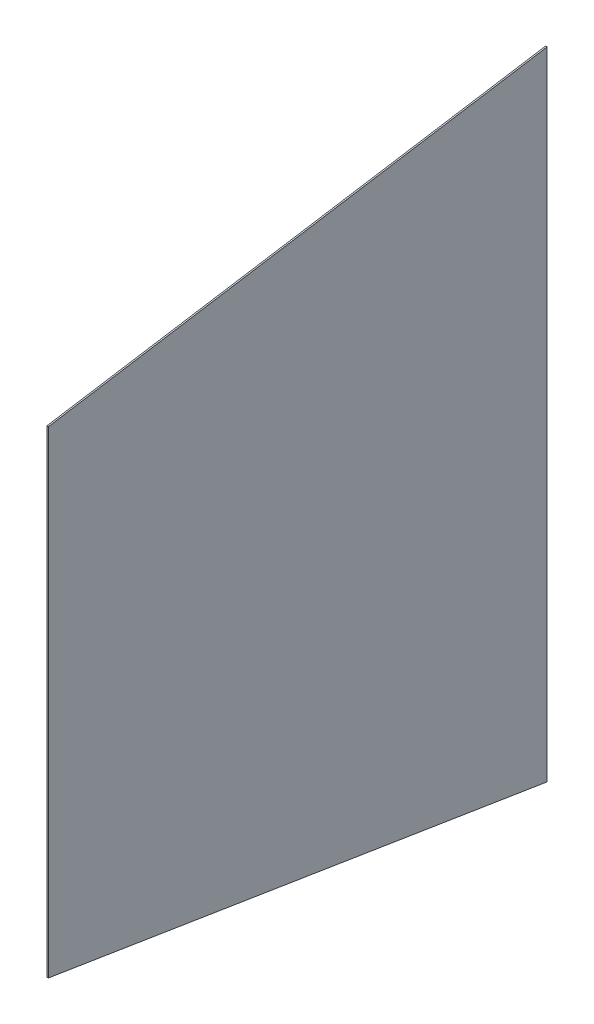
ISO-10303-21;
HEADER;
FILE_DESCRIPTION(('STEP AP214'),'2;1');
FILE_NAME('part.step','',(''),(''),'','','');
FILE_SCHEMA(('AUTOMOTIVE_DESIGN { 1 0 10303 214 1 1 1 1 }'));
ENDSEC;
DATA;
#1=APPLICATION_CONTEXT('core data for automotive mechanical design processes');
#2=APPLICATION_PROTOCOL_DEFINITION('international standard','automotive_design',2000,#1);
#3=PRODUCT_CONTEXT('',#1,'mechanical');
#4=PRODUCT('Part','Part','',(#3));
#5=PRODUCT_RELATED_PRODUCT_CATEGORY('part','',(#4));
#6=PRODUCT_DEFINITION_FORMATION('','',#4);
#7=PRODUCT_DEFINITION_CONTEXT('part definition',#1,'design');
#8=PRODUCT_DEFINITION('design','',#6,#7);
#9=PRODUCT_DEFINITION_SHAPE('','',#8);
#10=(LENGTH_UNIT() NAMED_UNIT(*) SI_UNIT(.MILLI.,.METRE.));
#11=(NAMED_UNIT(*) PLANE_ANGLE_UNIT() SI_UNIT($,.RADIAN.));
#12=(NAMED_UNIT(*) SI_UNIT($,.STERADIAN.) SOLID_ANGLE_UNIT());
#13=UNCERTAINTY_MEASURE_WITH_UNIT(LENGTH_MEASURE(1.E-05),#10,'distance_accuracy_value','');
#14=(GEOMETRIC_REPRESENTATION_CONTEXT(3) GLOBAL_UNCERTAINTY_ASSIGNED_CONTEXT((#13)) GLOBAL_UNIT_ASSIGNED_CONTEXT((#10,
#11,#12)) REPRESENTATION_CONTEXT('',''));
#15=CARTESIAN_POINT('',(0.,0.,0.));
#16=DIRECTION('',(0.,0.,1.));
#17=DIRECTION('',(1.,0.,0.));
#18=AXIS2_PLACEMENT_3D('',#15,#16,#17);
#19=CARTESIAN_POINT('',(0.,0.,0.));
#20=DIRECTION('',(1.,0.,0.));
#21=DIRECTION('',(0.,0.,-1.));
#22=AXIS2_PLACEMENT_3D('',#19,#20,#21);
#23=PLANE('',#22);
#24=DIRECTION('',(0.,1.,0.));
#25=VECTOR('',#24,1.);
#26=CARTESIAN_POINT('',(0.,-660.4,0.));
#27=LINE('',#26,#25);
#28=CARTESIAN_POINT('',(0.,-660.399999999999,-3.60822483003176E-13));
#29=VERTEX_POINT('',#28);
#30=CARTESIAN_POINT('',(0.,660.4,0.));
#31=VERTEX_POINT('',#30);
#32=EDGE_CURVE('E95',#29,#31,#27,.T.);
#33=ORIENTED_EDGE('',*,*,#32,.F.);
#34=DIRECTION('',(0.,-0.157517910379392,-0.987516130455452));
#35=VECTOR('',#34,1.);
#36=CARTESIAN_POINT('',(0.,-495.3,1035.05));
#37=LINE('',#36,#35);
#38=CARTESIAN_POINT('',(0.,-495.3,1035.05));
#39=VERTEX_POINT('',#38);
#40=EDGE_CURVE('E71',#39,#29,#37,.T.);
#41=ORIENTED_EDGE('',*,*,#40,.F.);
#42=DIRECTION('',(0.,1.,0.));
#43=VECTOR('',#42,1.);
#44=CARTESIAN_POINT('',(0.,495.3,1035.05));
#45=LINE('',#44,#43);
#46=CARTESIAN_POINT('',(0.,495.300000000001,1035.05));
#47=VERTEX_POINT('',#46);
#48=EDGE_CURVE('E73',#47,#39,#45,.F.);
#49=ORIENTED_EDGE('',*,*,#48,.F.);
#50=DIRECTION('',(0.,-0.157517910379392,0.987516130455452));
#51=VECTOR('',#50,1.);
#52=CARTESIAN_POINT('',(0.,660.4,0.));
#53=LINE('',#52,#51);
#54=EDGE_CURVE('E36',#31,#47,#53,.T.);
#55=ORIENTED_EDGE('',*,*,#54,.F.);
#56=EDGE_LOOP('',(#33,#41,#49,#55));
#57=FACE_BOUND('',#56,.T.);
#58=ADVANCED_FACE('F33',(#57),#23,.F.);
#59=CARTESIAN_POINT('',(0.,660.4,0.));
#60=DIRECTION('',(0.,0.987516130455452,0.157517910379392));
#61=DIRECTION('',(0.,-0.157517910379392,0.987516130455452));
#62=AXIS2_PLACEMENT_3D('',#59,#60,#61);
#63=PLANE('',#62);
#64=DIRECTION('',(0.,-0.157517910379397,0.987516130455451));
#65=VECTOR('',#64,1.);
#66=CARTESIAN_POINT('',(3.175,660.4,0.));
#67=LINE('',#66,#65);
#68=CARTESIAN_POINT('',(3.175,660.4,0.));
#69=VERTEX_POINT('',#68);
#70=CARTESIAN_POINT('',(3.175,495.300000000003,1035.05));
#71=VERTEX_POINT('',#70);
#72=EDGE_CURVE('E99',#69,#71,#67,.T.);
#73=ORIENTED_EDGE('',*,*,#72,.F.);
#74=DIRECTION('',(-1.,0.,0.));
#75=VECTOR('',#74,1.);
#76=CARTESIAN_POINT('',(0.,660.4,0.));
#77=LINE('',#76,#75);
#78=EDGE_CURVE('E84',#31,#69,#77,.F.);
#79=ORIENTED_EDGE('',*,*,#78,.F.);
#80=ORIENTED_EDGE('',*,*,#54,.T.);
#81=DIRECTION('',(1.,0.,0.));
#82=VECTOR('',#81,1.);
#83=CARTESIAN_POINT('',(0.,495.3,1035.05));
#84=LINE('',#83,#82);
#85=EDGE_CURVE('E79',#71,#47,#84,.F.);
#86=ORIENTED_EDGE('',*,*,#85,.F.);
#87=EDGE_LOOP('',(#73,#79,#80,#86));
#88=FACE_BOUND('',#87,.T.);
#89=ADVANCED_FACE('F81',(#88),#63,.T.);
#90=CARTESIAN_POINT('',(0.,495.3,1035.05));
#91=DIRECTION('',(0.,0.,1.));
#92=DIRECTION('',(1.,0.,0.));
#93=AXIS2_PLACEMENT_3D('',#90,#91,#92);
#94=PLANE('',#93);
#95=DIRECTION('',(0.,1.,0.));
#96=VECTOR('',#95,1.);
#97=CARTESIAN_POINT('',(3.175,0.,1035.05));
#98=LINE('',#97,#96);
#99=CARTESIAN_POINT('',(3.175,-495.3,1035.05));
#100=VERTEX_POINT('',#99);
#101=EDGE_CURVE('E88',#71,#100,#98,.F.);
#102=ORIENTED_EDGE('',*,*,#101,.F.);
#103=ORIENTED_EDGE('',*,*,#85,.T.);
#104=ORIENTED_EDGE('',*,*,#48,.T.);
#105=DIRECTION('',(1.,0.,0.));
#106=VECTOR('',#105,1.);
#107=CARTESIAN_POINT('',(0.,-495.3,1035.05));
#108=LINE('',#107,#106);
#109=EDGE_CURVE('E91',#100,#39,#108,.F.);
#110=ORIENTED_EDGE('',*,*,#109,.F.);
#111=EDGE_LOOP('',(#102,#103,#104,#110));
#112=FACE_BOUND('',#111,.T.);
#113=ADVANCED_FACE('F86',(#112),#94,.T.);
#114=CARTESIAN_POINT('',(0.,-495.3,1035.05));
#115=DIRECTION('',(0.,-0.987516130455452,0.157517910379392));
#116=DIRECTION('',(0.,-0.157517910379392,-0.987516130455452));
#117=AXIS2_PLACEMENT_3D('',#114,#115,#116);
#118=PLANE('',#117);
#119=DIRECTION('',(0.,-0.157517910379397,-0.987516130455451));
#120=VECTOR('',#119,1.);
#121=CARTESIAN_POINT('',(3.175,-495.3,1035.05));
#122=LINE('',#121,#120);
#123=CARTESIAN_POINT('',(3.175,-660.399999999997,-6.38378239159465E-13));
#124=VERTEX_POINT('',#123);
#125=EDGE_CURVE('E42',#100,#124,#122,.T.);
#126=ORIENTED_EDGE('',*,*,#125,.F.);
#127=ORIENTED_EDGE('',*,*,#109,.T.);
#128=ORIENTED_EDGE('',*,*,#40,.T.);
#129=DIRECTION('',(-1.,0.,0.));
#130=VECTOR('',#129,1.);
#131=CARTESIAN_POINT('',(0.,-660.4,0.));
#132=LINE('',#131,#130);
#133=EDGE_CURVE('E51',#124,#29,#132,.T.);
#134=ORIENTED_EDGE('',*,*,#133,.F.);
#135=EDGE_LOOP('',(#126,#127,#128,#134));
#136=FACE_BOUND('',#135,.T.);
#137=ADVANCED_FACE('F105',(#136),#118,.T.);
#138=CARTESIAN_POINT('',(0.,-660.4,0.));
#139=DIRECTION('',(0.,0.,-1.));
#140=DIRECTION('',(-1.,0.,0.));
#141=AXIS2_PLACEMENT_3D('',#138,#139,#140);
#142=PLANE('',#141);
#143=DIRECTION('',(0.,1.,0.));
#144=VECTOR('',#143,1.);
#145=CARTESIAN_POINT('',(3.175,0.,0.));
#146=LINE('',#145,#144);
#147=EDGE_CURVE('E11',#124,#69,#146,.T.);
#148=ORIENTED_EDGE('',*,*,#147,.F.);
#149=ORIENTED_EDGE('',*,*,#133,.T.);
#150=ORIENTED_EDGE('',*,*,#32,.T.);
#151=ORIENTED_EDGE('',*,*,#78,.T.);
#152=EDGE_LOOP('',(#148,#149,#150,#151));
#153=FACE_BOUND('',#152,.T.);
#154=ADVANCED_FACE('F107',(#153),#142,.T.);
#155=CARTESIAN_POINT('',(3.175,0.,0.));
#156=DIRECTION('',(1.,0.,0.));
#157=DIRECTION('',(0.,0.,-1.));
#158=AXIS2_PLACEMENT_3D('',#155,#156,#157);
#159=PLANE('',#158);
#160=ORIENTED_EDGE('',*,*,#125,.T.);
#161=ORIENTED_EDGE('',*,*,#147,.T.);
#162=ORIENTED_EDGE('',*,*,#72,.T.);
#163=ORIENTED_EDGE('',*,*,#101,.T.);
#164=EDGE_LOOP('',(#160,#161,#162,#163));
#165=FACE_BOUND('',#164,.T.);
#166=ADVANCED_FACE('F104',(#165),#159,.T.);
#167=CLOSED_SHELL('',(#58,#89,#113,#137,#154,#166));
#168=MANIFOLD_SOLID_BREP('B2',#167);
#169=ADVANCED_BREP_SHAPE_REPRESENTATION('',(#18,#168),#14);
#170=SHAPE_DEFINITION_REPRESENTATION(#9,#169);
ENDSEC;
END-ISO-10303-21;
